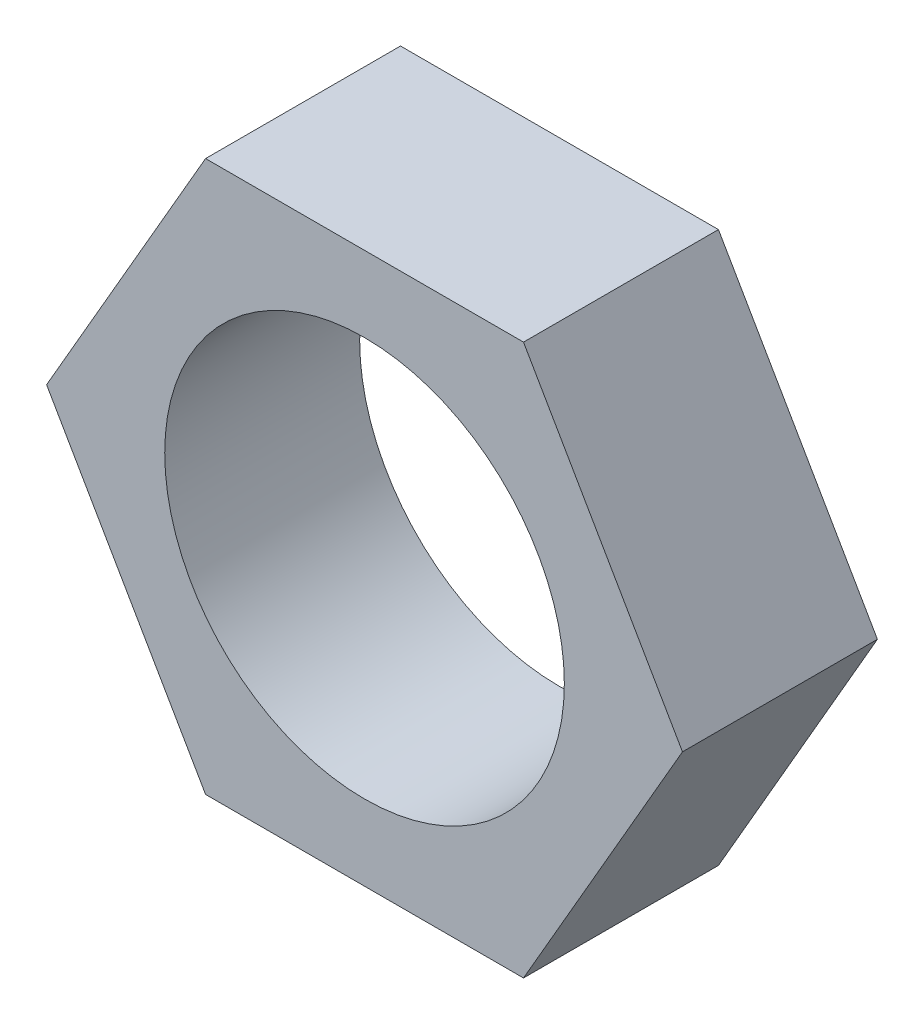
ISO-10303-21;
HEADER;
FILE_DESCRIPTION(('STEP AP214'),'2;1');
FILE_NAME('part.step','',(''),(''),'','','');
FILE_SCHEMA(('AUTOMOTIVE_DESIGN { 1 0 10303 214 1 1 1 1 }'));
ENDSEC;
DATA;
#1=APPLICATION_CONTEXT('core data for automotive mechanical design processes');
#2=APPLICATION_PROTOCOL_DEFINITION('international standard','automotive_design',2000,#1);
#3=PRODUCT_CONTEXT('',#1,'mechanical');
#4=PRODUCT('Part','Part','',(#3));
#5=PRODUCT_RELATED_PRODUCT_CATEGORY('part','',(#4));
#6=PRODUCT_DEFINITION_FORMATION('','',#4);
#7=PRODUCT_DEFINITION_CONTEXT('part definition',#1,'design');
#8=PRODUCT_DEFINITION('design','',#6,#7);
#9=PRODUCT_DEFINITION_SHAPE('','',#8);
#10=(LENGTH_UNIT() NAMED_UNIT(*) SI_UNIT(.MILLI.,.METRE.));
#11=(NAMED_UNIT(*) PLANE_ANGLE_UNIT() SI_UNIT($,.RADIAN.));
#12=(NAMED_UNIT(*) SI_UNIT($,.STERADIAN.) SOLID_ANGLE_UNIT());
#13=UNCERTAINTY_MEASURE_WITH_UNIT(LENGTH_MEASURE(1.E-05),#10,'distance_accuracy_value','');
#14=(GEOMETRIC_REPRESENTATION_CONTEXT(3) GLOBAL_UNCERTAINTY_ASSIGNED_CONTEXT((#13)) GLOBAL_UNIT_ASSIGNED_CONTEXT((#10,
#11,#12)) REPRESENTATION_CONTEXT('',''));
#15=CARTESIAN_POINT('',(0.,0.,0.));
#16=DIRECTION('',(0.,0.,1.));
#17=DIRECTION('',(1.,0.,0.));
#18=AXIS2_PLACEMENT_3D('',#15,#16,#17);
#19=CARTESIAN_POINT('',(6.52405804184277,0.,2.));
#20=DIRECTION('',(-0.866025403784439,-0.5,0.));
#21=DIRECTION('',(0.5,-0.866025403784438,0.));
#22=AXIS2_PLACEMENT_3D('',#19,#20,#21);
#23=PLANE('',#22);
#24=DIRECTION('',(-0.5,0.866025403784438,0.));
#25=VECTOR('',#24,1.);
#26=CARTESIAN_POINT('',(6.52405804184277,0.,-2.));
#27=LINE('',#26,#25);
#28=CARTESIAN_POINT('',(6.52405804184277,0.,-2.));
#29=VERTEX_POINT('',#28);
#30=CARTESIAN_POINT('',(3.26202902092139,5.65,-2.));
#31=VERTEX_POINT('',#30);
#32=EDGE_CURVE('E121',#29,#31,#27,.T.);
#33=ORIENTED_EDGE('',*,*,#32,.T.);
#34=DIRECTION('',(0.,0.,-1.));
#35=VECTOR('',#34,1.);
#36=CARTESIAN_POINT('',(3.26202902092139,5.65,2.));
#37=LINE('',#36,#35);
#38=CARTESIAN_POINT('',(3.26202902092139,5.65,2.));
#39=VERTEX_POINT('',#38);
#40=EDGE_CURVE('E11',#39,#31,#37,.T.);
#41=ORIENTED_EDGE('',*,*,#40,.F.);
#42=DIRECTION('',(-0.5,0.866025403784438,0.));
#43=VECTOR('',#42,1.);
#44=CARTESIAN_POINT('',(6.52405804184277,0.,2.));
#45=LINE('',#44,#43);
#46=CARTESIAN_POINT('',(6.52405804184277,0.,2.));
#47=VERTEX_POINT('',#46);
#48=EDGE_CURVE('E132',#47,#39,#45,.T.);
#49=ORIENTED_EDGE('',*,*,#48,.F.);
#50=DIRECTION('',(0.,0.,-1.));
#51=VECTOR('',#50,1.);
#52=CARTESIAN_POINT('',(6.52405804184277,0.,2.));
#53=LINE('',#52,#51);
#54=EDGE_CURVE('E117',#47,#29,#53,.T.);
#55=ORIENTED_EDGE('',*,*,#54,.T.);
#56=EDGE_LOOP('',(#33,#41,#49,#55));
#57=FACE_BOUND('',#56,.T.);
#58=ADVANCED_FACE('F37',(#57),#23,.F.);
#59=CARTESIAN_POINT('',(3.26202902092139,5.65,2.));
#60=DIRECTION('',(0.,-1.,0.));
#61=DIRECTION('',(0.,0.,-1.));
#62=AXIS2_PLACEMENT_3D('',#59,#60,#61);
#63=PLANE('',#62);
#64=DIRECTION('',(-1.,0.,0.));
#65=VECTOR('',#64,1.);
#66=CARTESIAN_POINT('',(3.26202902092139,5.65,-2.));
#67=LINE('',#66,#65);
#68=CARTESIAN_POINT('',(-3.26202902092139,5.65,-2.));
#69=VERTEX_POINT('',#68);
#70=EDGE_CURVE('E124',#31,#69,#67,.T.);
#71=ORIENTED_EDGE('',*,*,#70,.T.);
#72=DIRECTION('',(0.,0.,-1.));
#73=VECTOR('',#72,1.);
#74=CARTESIAN_POINT('',(-3.26202902092139,5.65,2.));
#75=LINE('',#74,#73);
#76=CARTESIAN_POINT('',(-3.26202902092139,5.65,2.));
#77=VERTEX_POINT('',#76);
#78=EDGE_CURVE('E45',#77,#69,#75,.T.);
#79=ORIENTED_EDGE('',*,*,#78,.F.);
#80=DIRECTION('',(-1.,0.,0.));
#81=VECTOR('',#80,1.);
#82=CARTESIAN_POINT('',(3.26202902092139,5.65,2.));
#83=LINE('',#82,#81);
#84=EDGE_CURVE('E90',#39,#77,#83,.T.);
#85=ORIENTED_EDGE('',*,*,#84,.F.);
#86=ORIENTED_EDGE('',*,*,#40,.T.);
#87=EDGE_LOOP('',(#71,#79,#85,#86));
#88=FACE_BOUND('',#87,.T.);
#89=ADVANCED_FACE('F157',(#88),#63,.F.);
#90=CARTESIAN_POINT('',(-3.26202902092139,5.65,2.));
#91=DIRECTION('',(0.866025403784439,-0.5,0.));
#92=DIRECTION('',(0.5,0.866025403784439,0.));
#93=AXIS2_PLACEMENT_3D('',#90,#91,#92);
#94=PLANE('',#93);
#95=DIRECTION('',(-0.5,-0.866025403784439,0.));
#96=VECTOR('',#95,1.);
#97=CARTESIAN_POINT('',(-3.26202902092139,5.65,-2.));
#98=LINE('',#97,#96);
#99=CARTESIAN_POINT('',(-6.52405804184277,0.,-2.));
#100=VERTEX_POINT('',#99);
#101=EDGE_CURVE('E127',#69,#100,#98,.T.);
#102=ORIENTED_EDGE('',*,*,#101,.T.);
#103=DIRECTION('',(0.,0.,-1.));
#104=VECTOR('',#103,1.);
#105=CARTESIAN_POINT('',(-6.52405804184277,0.,2.));
#106=LINE('',#105,#104);
#107=CARTESIAN_POINT('',(-6.52405804184277,0.,2.));
#108=VERTEX_POINT('',#107);
#109=EDGE_CURVE('E112',#108,#100,#106,.T.);
#110=ORIENTED_EDGE('',*,*,#109,.F.);
#111=DIRECTION('',(-0.5,-0.866025403784439,0.));
#112=VECTOR('',#111,1.);
#113=CARTESIAN_POINT('',(-3.26202902092139,5.65,2.));
#114=LINE('',#113,#112);
#115=EDGE_CURVE('E103',#77,#108,#114,.T.);
#116=ORIENTED_EDGE('',*,*,#115,.F.);
#117=ORIENTED_EDGE('',*,*,#78,.T.);
#118=EDGE_LOOP('',(#102,#110,#116,#117));
#119=FACE_BOUND('',#118,.T.);
#120=ADVANCED_FACE('F138',(#119),#94,.F.);
#121=CARTESIAN_POINT('',(-6.52405804184277,0.,2.));
#122=DIRECTION('',(0.866025403784439,0.5,0.));
#123=DIRECTION('',(-0.5,0.866025403784439,0.));
#124=AXIS2_PLACEMENT_3D('',#121,#122,#123);
#125=PLANE('',#124);
#126=DIRECTION('',(0.5,-0.866025403784439,0.));
#127=VECTOR('',#126,1.);
#128=CARTESIAN_POINT('',(-6.52405804184277,0.,-2.));
#129=LINE('',#128,#127);
#130=CARTESIAN_POINT('',(-3.26202902092138,-5.65,-2.));
#131=VERTEX_POINT('',#130);
#132=EDGE_CURVE('E111',#100,#131,#129,.T.);
#133=ORIENTED_EDGE('',*,*,#132,.T.);
#134=DIRECTION('',(0.,0.,-1.));
#135=VECTOR('',#134,1.);
#136=CARTESIAN_POINT('',(-3.26202902092138,-5.65,2.));
#137=LINE('',#136,#135);
#138=CARTESIAN_POINT('',(-3.26202902092138,-5.65,2.));
#139=VERTEX_POINT('',#138);
#140=EDGE_CURVE('E108',#139,#131,#137,.T.);
#141=ORIENTED_EDGE('',*,*,#140,.F.);
#142=DIRECTION('',(0.5,-0.866025403784439,0.));
#143=VECTOR('',#142,1.);
#144=CARTESIAN_POINT('',(-6.52405804184277,0.,2.));
#145=LINE('',#144,#143);
#146=EDGE_CURVE('E97',#108,#139,#145,.T.);
#147=ORIENTED_EDGE('',*,*,#146,.F.);
#148=ORIENTED_EDGE('',*,*,#109,.T.);
#149=EDGE_LOOP('',(#133,#141,#147,#148));
#150=FACE_BOUND('',#149,.T.);
#151=ADVANCED_FACE('F109',(#150),#125,.F.);
#152=CARTESIAN_POINT('',(-3.26202902092138,-5.65,2.));
#153=DIRECTION('',(0.,1.,0.));
#154=DIRECTION('',(0.,0.,1.));
#155=AXIS2_PLACEMENT_3D('',#152,#153,#154);
#156=PLANE('',#155);
#157=DIRECTION('',(1.,0.,0.));
#158=VECTOR('',#157,1.);
#159=CARTESIAN_POINT('',(-3.26202902092138,-5.65,-2.));
#160=LINE('',#159,#158);
#161=CARTESIAN_POINT('',(3.26202902092138,-5.65,-2.));
#162=VERTEX_POINT('',#161);
#163=EDGE_CURVE('E76',#131,#162,#160,.T.);
#164=ORIENTED_EDGE('',*,*,#163,.T.);
#165=DIRECTION('',(0.,0.,-1.));
#166=VECTOR('',#165,1.);
#167=CARTESIAN_POINT('',(3.26202902092138,-5.65,2.));
#168=LINE('',#167,#166);
#169=CARTESIAN_POINT('',(3.26202902092138,-5.65,2.));
#170=VERTEX_POINT('',#169);
#171=EDGE_CURVE('E113',#170,#162,#168,.T.);
#172=ORIENTED_EDGE('',*,*,#171,.F.);
#173=DIRECTION('',(1.,0.,0.));
#174=VECTOR('',#173,1.);
#175=CARTESIAN_POINT('',(-3.26202902092138,-5.65,2.));
#176=LINE('',#175,#174);
#177=EDGE_CURVE('E101',#139,#170,#176,.T.);
#178=ORIENTED_EDGE('',*,*,#177,.F.);
#179=ORIENTED_EDGE('',*,*,#140,.T.);
#180=EDGE_LOOP('',(#164,#172,#178,#179));
#181=FACE_BOUND('',#180,.T.);
#182=ADVANCED_FACE('F115',(#181),#156,.F.);
#183=CARTESIAN_POINT('',(3.26202902092138,-5.65,2.));
#184=DIRECTION('',(-0.866025403784439,0.5,0.));
#185=DIRECTION('',(-0.5,-0.866025403784438,0.));
#186=AXIS2_PLACEMENT_3D('',#183,#184,#185);
#187=PLANE('',#186);
#188=DIRECTION('',(0.5,0.866025403784438,0.));
#189=VECTOR('',#188,1.);
#190=CARTESIAN_POINT('',(3.26202902092138,-5.65,-2.));
#191=LINE('',#190,#189);
#192=EDGE_CURVE('E82',#162,#29,#191,.T.);
#193=ORIENTED_EDGE('',*,*,#192,.T.);
#194=ORIENTED_EDGE('',*,*,#54,.F.);
#195=DIRECTION('',(0.5,0.866025403784438,0.));
#196=VECTOR('',#195,1.);
#197=CARTESIAN_POINT('',(3.26202902092138,-5.65,2.));
#198=LINE('',#197,#196);
#199=EDGE_CURVE('E53',#170,#47,#198,.T.);
#200=ORIENTED_EDGE('',*,*,#199,.F.);
#201=ORIENTED_EDGE('',*,*,#171,.T.);
#202=EDGE_LOOP('',(#193,#194,#200,#201));
#203=FACE_BOUND('',#202,.T.);
#204=ADVANCED_FACE('F145',(#203),#187,.F.);
#205=CARTESIAN_POINT('',(0.,0.,2.));
#206=DIRECTION('',(0.,0.,1.));
#207=DIRECTION('',(1.,0.,0.));
#208=AXIS2_PLACEMENT_3D('',#205,#206,#207);
#209=PLANE('',#208);
#210=CARTESIAN_POINT('',(0.,0.,2.));
#211=DIRECTION('',(0.,0.,1.));
#212=DIRECTION('',(1.,0.,0.));
#213=AXIS2_PLACEMENT_3D('',#210,#211,#212);
#214=CIRCLE('',#213,4.1);
#215=CARTESIAN_POINT('',(4.1,0.,2.));
#216=VERTEX_POINT('',#215);
#217=EDGE_CURVE('E244',#216,#216,#214,.T.);
#218=ORIENTED_EDGE('',*,*,#217,.F.);
#219=EDGE_LOOP('',(#218));
#220=FACE_BOUND('',#219,.T.);
#221=ORIENTED_EDGE('',*,*,#48,.T.);
#222=ORIENTED_EDGE('',*,*,#84,.T.);
#223=ORIENTED_EDGE('',*,*,#115,.T.);
#224=ORIENTED_EDGE('',*,*,#146,.T.);
#225=ORIENTED_EDGE('',*,*,#177,.T.);
#226=ORIENTED_EDGE('',*,*,#199,.T.);
#227=EDGE_LOOP('',(#221,#222,#223,#224,#225,#226));
#228=FACE_BOUND('',#227,.T.);
#229=ADVANCED_FACE('F99',(#220,#228),#209,.T.);
#230=CARTESIAN_POINT('',(0.,0.,-2.));
#231=DIRECTION('',(0.,0.,1.));
#232=DIRECTION('',(1.,0.,0.));
#233=AXIS2_PLACEMENT_3D('',#230,#231,#232);
#234=PLANE('',#233);
#235=CARTESIAN_POINT('',(0.,0.,-2.));
#236=DIRECTION('',(0.,0.,1.));
#237=DIRECTION('',(1.,0.,0.));
#238=AXIS2_PLACEMENT_3D('',#235,#236,#237);
#239=CIRCLE('',#238,4.1);
#240=CARTESIAN_POINT('',(4.1,0.,-2.));
#241=VERTEX_POINT('',#240);
#242=EDGE_CURVE('E125',#241,#241,#239,.T.);
#243=ORIENTED_EDGE('',*,*,#242,.T.);
#244=EDGE_LOOP('',(#243));
#245=FACE_BOUND('',#244,.T.);
#246=ORIENTED_EDGE('',*,*,#32,.F.);
#247=ORIENTED_EDGE('',*,*,#192,.F.);
#248=ORIENTED_EDGE('',*,*,#163,.F.);
#249=ORIENTED_EDGE('',*,*,#132,.F.);
#250=ORIENTED_EDGE('',*,*,#101,.F.);
#251=ORIENTED_EDGE('',*,*,#70,.F.);
#252=EDGE_LOOP('',(#246,#247,#248,#249,#250,#251));
#253=FACE_BOUND('',#252,.T.);
#254=ADVANCED_FACE('F141',(#245,#253),#234,.F.);
#255=CARTESIAN_POINT('',(0.,0.,-2.));
#256=DIRECTION('',(0.,0.,1.));
#257=DIRECTION('',(1.,0.,0.));
#258=AXIS2_PLACEMENT_3D('',#255,#256,#257);
#259=CYLINDRICAL_SURFACE('',#258,4.1);
#260=ORIENTED_EDGE('',*,*,#242,.F.);
#261=EDGE_LOOP('',(#260));
#262=FACE_BOUND('',#261,.T.);
#263=ORIENTED_EDGE('',*,*,#217,.T.);
#264=EDGE_LOOP('',(#263));
#265=FACE_BOUND('',#264,.T.);
#266=ADVANCED_FACE('F197',(#262,#265),#259,.F.);
#267=CLOSED_SHELL('',(#58,#89,#120,#151,#182,#204,#229,#254,#266));
#268=MANIFOLD_SOLID_BREP('B2',#267);
#269=ADVANCED_BREP_SHAPE_REPRESENTATION('',(#18,#268),#14);
#270=SHAPE_DEFINITION_REPRESENTATION(#9,#269);
ENDSEC;
END-ISO-10303-21;
